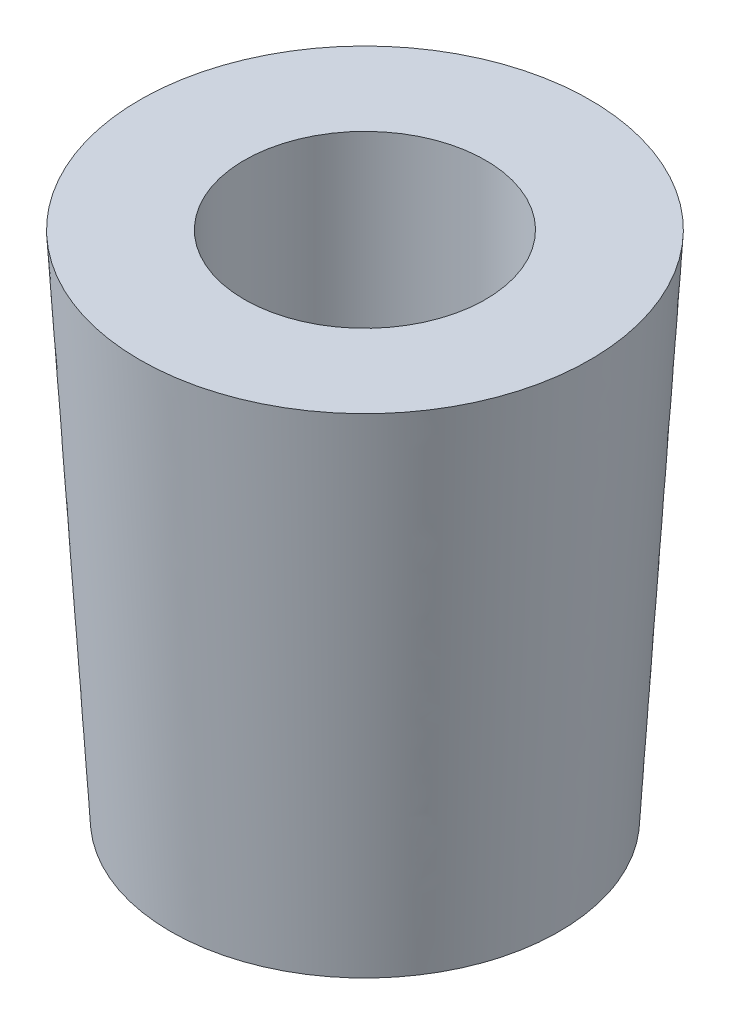
ISO-10303-21;
HEADER;
FILE_DESCRIPTION(('STEP AP214'),'2;1');
FILE_NAME('part.step','',(''),(''),'','','');
FILE_SCHEMA(('AUTOMOTIVE_DESIGN { 1 0 10303 214 1 1 1 1 }'));
ENDSEC;
DATA;
#1=APPLICATION_CONTEXT('core data for automotive mechanical design processes');
#2=APPLICATION_PROTOCOL_DEFINITION('international standard','automotive_design',2000,#1);
#3=PRODUCT_CONTEXT('',#1,'mechanical');
#4=PRODUCT('Part','Part','',(#3));
#5=PRODUCT_RELATED_PRODUCT_CATEGORY('part','',(#4));
#6=PRODUCT_DEFINITION_FORMATION('','',#4);
#7=PRODUCT_DEFINITION_CONTEXT('part definition',#1,'design');
#8=PRODUCT_DEFINITION('design','',#6,#7);
#9=PRODUCT_DEFINITION_SHAPE('','',#8);
#10=(LENGTH_UNIT() NAMED_UNIT(*) SI_UNIT(.MILLI.,.METRE.));
#11=(NAMED_UNIT(*) PLANE_ANGLE_UNIT() SI_UNIT($,.RADIAN.));
#12=(NAMED_UNIT(*) SI_UNIT($,.STERADIAN.) SOLID_ANGLE_UNIT());
#13=UNCERTAINTY_MEASURE_WITH_UNIT(LENGTH_MEASURE(1.E-05),#10,'distance_accuracy_value','');
#14=(GEOMETRIC_REPRESENTATION_CONTEXT(3) GLOBAL_UNCERTAINTY_ASSIGNED_CONTEXT((#13)) GLOBAL_UNIT_ASSIGNED_CONTEXT((#10,
#11,#12)) REPRESENTATION_CONTEXT('',''));
#15=CARTESIAN_POINT('',(0.,0.,0.));
#16=DIRECTION('',(0.,0.,1.));
#17=DIRECTION('',(1.,0.,0.));
#18=AXIS2_PLACEMENT_3D('',#15,#16,#17);
#19=CARTESIAN_POINT('',(0.,-3.175,0.));
#20=DIRECTION('',(0.,1.,0.));
#21=DIRECTION('',(0.,0.,1.));
#22=AXIS2_PLACEMENT_3D('',#19,#20,#21);
#23=PLANE('',#22);
#24=CARTESIAN_POINT('',(0.,-3.175,0.));
#25=DIRECTION('',(0.,1.,0.));
#26=DIRECTION('',(0.,0.,1.));
#27=AXIS2_PLACEMENT_3D('',#24,#25,#26);
#28=CIRCLE('',#27,1.5);
#29=CARTESIAN_POINT('',(0.,-3.175,1.5));
#30=VERTEX_POINT('',#29);
#31=EDGE_CURVE('E67',#30,#30,#28,.T.);
#32=ORIENTED_EDGE('',*,*,#31,.T.);
#33=EDGE_LOOP('',(#32));
#34=FACE_BOUND('',#33,.T.);
#35=CARTESIAN_POINT('',(0.,-3.175,0.));
#36=DIRECTION('',(0.,1.,0.));
#37=DIRECTION('',(0.,0.,1.));
#38=AXIS2_PLACEMENT_3D('',#35,#36,#37);
#39=CIRCLE('',#38,2.415);
#40=CARTESIAN_POINT('',(0.,-3.175,2.415));
#41=VERTEX_POINT('',#40);
#42=EDGE_CURVE('E12',#41,#41,#39,.T.);
#43=ORIENTED_EDGE('',*,*,#42,.F.);
#44=EDGE_LOOP('',(#43));
#45=FACE_BOUND('',#44,.T.);
#46=ADVANCED_FACE('F54',(#34,#45),#23,.F.);
#47=CARTESIAN_POINT('',(0.,3.175,0.));
#48=DIRECTION('',(0.,1.,0.));
#49=DIRECTION('',(0.,0.,1.));
#50=AXIS2_PLACEMENT_3D('',#47,#48,#49);
#51=PLANE('',#50);
#52=CARTESIAN_POINT('',(0.,3.175,0.));
#53=DIRECTION('',(0.,1.,0.));
#54=DIRECTION('',(0.,0.,1.));
#55=AXIS2_PLACEMENT_3D('',#52,#53,#54);
#56=CIRCLE('',#55,1.5);
#57=CARTESIAN_POINT('',(0.,3.175,1.5));
#58=VERTEX_POINT('',#57);
#59=EDGE_CURVE('E130',#58,#58,#56,.T.);
#60=ORIENTED_EDGE('',*,*,#59,.F.);
#61=EDGE_LOOP('',(#60));
#62=FACE_BOUND('',#61,.T.);
#63=CARTESIAN_POINT('',(0.,3.175,0.));
#64=DIRECTION('',(0.,1.,0.));
#65=DIRECTION('',(0.,0.,1.));
#66=AXIS2_PLACEMENT_3D('',#63,#64,#65);
#67=CIRCLE('',#66,2.8);
#68=CARTESIAN_POINT('',(0.,3.175,2.8));
#69=VERTEX_POINT('',#68);
#70=EDGE_CURVE('E62',#69,#69,#67,.T.);
#71=ORIENTED_EDGE('',*,*,#70,.T.);
#72=EDGE_LOOP('',(#71));
#73=FACE_BOUND('',#72,.T.);
#74=ADVANCED_FACE('F87',(#62,#73),#51,.T.);
#75=CARTESIAN_POINT('',(0.,3.175,2.8));
#76=CARTESIAN_POINT('',(0.,1.05833333333333,2.67166666666667));
#77=CARTESIAN_POINT('',(0.,-1.05833333333333,2.54333333333333));
#78=CARTESIAN_POINT('',(0.,-3.175,2.415));
#79=CARTESIAN_POINT('',(-0.0772681013892341,3.175,2.8));
#80=CARTESIAN_POINT('',(-0.0737266467422275,1.05833333333333,2.67166666666667));
#81=CARTESIAN_POINT('',(-0.070185192095221,-1.05833333333333,2.54333333333333));
#82=CARTESIAN_POINT('',(-0.0666437374482144,-3.175,2.415));
#83=CARTESIAN_POINT('',(-0.230350683889855,3.175,2.79372681013892));
#84=CARTESIAN_POINT('',(-0.21979294421157,1.05833333333333,2.66568099800756));
#85=CARTESIAN_POINT('',(-0.209235204533285,-1.05833333333333,2.53763518587619));
#86=CARTESIAN_POINT('',(-0.198677464855,-3.175,2.40958937374482));
#87=CARTESIAN_POINT('',(-0.454890761369762,3.175,2.76622039120156));
#88=CARTESIAN_POINT('',(-0.434041601473648,1.05833333333333,2.63943528993816));
#89=CARTESIAN_POINT('',(-0.413192441577534,-1.05833333333333,2.51265018867475));
#90=CARTESIAN_POINT('',(-0.39234328168142,-3.175,2.38586508741135));
#91=CARTESIAN_POINT('',(-0.67362410714116,3.175,2.72134027355594));
#92=CARTESIAN_POINT('',(-0.642749668897191,1.05833333333333,2.59661217768463));
#93=CARTESIAN_POINT('',(-0.611875230653221,-1.05833333333333,2.47188408181331));
#94=CARTESIAN_POINT('',(-0.581000792409251,-3.175,2.347155985942));
#95=CARTESIAN_POINT('',(-1.94684617889358,3.175,2.35215498805756));
#96=CARTESIAN_POINT('',(-1.85761572902763,1.05833333333333,2.24434788443825));
#97=CARTESIAN_POINT('',(-1.76838527916167,-1.05833333333333,2.13654078081895));
#98=CARTESIAN_POINT('',(-1.67915482929572,-3.175,2.02873367719964));
#99=CARTESIAN_POINT('',(-2.8,3.175,1.23628962222774));
#100=CARTESIAN_POINT('',(-2.67166666666667,1.05833333333333,1.17962634787564));
#101=CARTESIAN_POINT('',(-2.54333333333333,-1.05833333333333,1.12296307352353));
#102=CARTESIAN_POINT('',(-2.415,-3.175,1.06629979917143));
#103=CARTESIAN_POINT('',(-2.8,3.175,-1.54536202778468));
#104=CARTESIAN_POINT('',(-2.67166666666667,1.05833333333333,-1.47453293484455));
#105=CARTESIAN_POINT('',(-2.54333333333333,-1.05833333333333,-1.40370384190442));
#106=CARTESIAN_POINT('',(-2.415,-3.175,-1.33287474896429));
#107=CARTESIAN_POINT('',(-1.54536202778468,3.175,-2.8));
#108=CARTESIAN_POINT('',(-1.47453293484455,1.05833333333333,-2.67166666666667));
#109=CARTESIAN_POINT('',(-1.40370384190442,-1.05833333333333,-2.54333333333333));
#110=CARTESIAN_POINT('',(-1.33287474896429,-3.175,-2.415));
#111=CARTESIAN_POINT('',(1.54536202778468,3.175,-2.8));
#112=CARTESIAN_POINT('',(1.47453293484455,1.05833333333333,-2.67166666666667));
#113=CARTESIAN_POINT('',(1.40370384190442,-1.05833333333333,-2.54333333333333));
#114=CARTESIAN_POINT('',(1.33287474896429,-3.175,-2.415));
#115=CARTESIAN_POINT('',(2.8,3.175,-1.54536202778468));
#116=CARTESIAN_POINT('',(2.67166666666667,1.05833333333333,-1.47453293484455));
#117=CARTESIAN_POINT('',(2.54333333333333,-1.05833333333333,-1.40370384190442));
#118=CARTESIAN_POINT('',(2.415,-3.175,-1.33287474896429));
#119=CARTESIAN_POINT('',(2.8,3.175,1.23628962222774));
#120=CARTESIAN_POINT('',(2.67166666666667,1.05833333333333,1.17962634787564));
#121=CARTESIAN_POINT('',(2.54333333333333,-1.05833333333333,1.12296307352353));
#122=CARTESIAN_POINT('',(2.415,-3.175,1.06629979917143));
#123=CARTESIAN_POINT('',(1.94684617889358,3.175,2.35215498805756));
#124=CARTESIAN_POINT('',(1.85761572902763,1.05833333333333,2.24434788443825));
#125=CARTESIAN_POINT('',(1.76838527916167,-1.05833333333333,2.13654078081895));
#126=CARTESIAN_POINT('',(1.67915482929572,-3.175,2.02873367719964));
#127=CARTESIAN_POINT('',(0.67362410714116,3.175,2.72134027355594));
#128=CARTESIAN_POINT('',(0.64274966889719,1.05833333333333,2.59661217768463));
#129=CARTESIAN_POINT('',(0.61187523065322,-1.05833333333333,2.47188408181331));
#130=CARTESIAN_POINT('',(0.58100079240925,-3.175,2.347155985942));
#131=CARTESIAN_POINT('',(0.454890761369762,3.175,2.76622039120156));
#132=CARTESIAN_POINT('',(0.434041601473648,1.05833333333333,2.63943528993816));
#133=CARTESIAN_POINT('',(0.413192441577533,-1.05833333333333,2.51265018867475));
#134=CARTESIAN_POINT('',(0.392343281681419,-3.175,2.38586508741135));
#135=CARTESIAN_POINT('',(0.230350683889855,3.175,2.79372681013892));
#136=CARTESIAN_POINT('',(0.21979294421157,1.05833333333333,2.66568099800756));
#137=CARTESIAN_POINT('',(0.209235204533285,-1.05833333333333,2.53763518587619));
#138=CARTESIAN_POINT('',(0.198677464855,-3.175,2.40958937374482));
#139=CARTESIAN_POINT('',(0.0772681013892334,3.175,2.8));
#140=CARTESIAN_POINT('',(0.0737266467422269,1.05833333333333,2.67166666666667));
#141=CARTESIAN_POINT('',(0.0701851920952203,-1.05833333333333,2.54333333333333));
#142=CARTESIAN_POINT('',(0.0666437374482138,-3.175,2.415));
#143=CARTESIAN_POINT('',(0.,3.175,2.8));
#144=CARTESIAN_POINT('',(0.,1.05833333333333,2.67166666666667));
#145=CARTESIAN_POINT('',(0.,-1.05833333333333,2.54333333333333));
#146=CARTESIAN_POINT('',(0.,-3.175,2.415));
#147=B_SPLINE_SURFACE_WITH_KNOTS('',3,3,((#75,#76,#77,#78),(#79,#80,#81,#82),(#83,#84,#85,#86),
(#87,#88,#89,#90),(#91,#92,#93,#94),(#95,#96,#97,#98),(#99,#100,#101,#102),(#103,#104,#105,
#106),(#107,#108,#109,#110),(#111,#112,#113,#114),(#115,#116,#117,#118),(#119,#120,#121,#122),
(#123,#124,#125,#126),(#127,#128,#129,#130),(#131,#132,#133,#134),(#135,#136,#137,#138),(#139,
#140,#141,#142),(#143,#144,#145,#146)),.UNSPECIFIED.,.T.,.F.,.F.,(4,1,1,1,1,2,2,2,1,1,1,1,4),(4,
4),(0.,0.0125,0.0249999999999999,0.0375000000000001,0.05,0.25,0.5,0.75,0.95,0.9625,0.975,0.9875,
1.),(0.,1.),.UNSPECIFIED.);
#148=CARTESIAN_POINT('',(0.,3.175,2.8));
#149=CARTESIAN_POINT('',(0.,3.10885416666667,2.79598958333333));
#150=CARTESIAN_POINT('',(0.,3.04270833333333,2.79197916666667));
#151=CARTESIAN_POINT('',(0.,2.91041666666667,2.78395833333333));
#152=CARTESIAN_POINT('',(0.,2.84427083333333,2.77994791666667));
#153=CARTESIAN_POINT('',(0.,2.71197916666667,2.77192708333333));
#154=CARTESIAN_POINT('',(0.,2.64583333333333,2.76791666666667));
#155=CARTESIAN_POINT('',(0.,2.51354166666667,2.75989583333333));
#156=CARTESIAN_POINT('',(0.,2.44739583333333,2.75588541666667));
#157=CARTESIAN_POINT('',(0.,2.31510416666667,2.74786458333333));
#158=CARTESIAN_POINT('',(0.,2.24895833333333,2.74385416666667));
#159=CARTESIAN_POINT('',(0.,2.11666666666667,2.73583333333333));
#160=CARTESIAN_POINT('',(0.,2.05052083333333,2.73182291666667));
#161=CARTESIAN_POINT('',(0.,1.91822916666667,2.72380208333333));
#162=CARTESIAN_POINT('',(0.,1.85208333333333,2.71979166666667));
#163=CARTESIAN_POINT('',(0.,1.71979166666667,2.71177083333333));
#164=CARTESIAN_POINT('',(0.,1.65364583333333,2.70776041666667));
#165=CARTESIAN_POINT('',(0.,1.52135416666667,2.69973958333333));
#166=CARTESIAN_POINT('',(0.,1.45520833333333,2.69572916666667));
#167=CARTESIAN_POINT('',(0.,1.32291666666667,2.68770833333333));
#168=CARTESIAN_POINT('',(0.,1.25677083333333,2.68369791666667));
#169=CARTESIAN_POINT('',(0.,1.12447916666667,2.67567708333333));
#170=CARTESIAN_POINT('',(0.,1.05833333333333,2.67166666666667));
#171=CARTESIAN_POINT('',(0.,0.926041666666667,2.66364583333333));
#172=CARTESIAN_POINT('',(0.,0.859895833333333,2.65963541666667));
#173=CARTESIAN_POINT('',(0.,0.727604166666667,2.65161458333333));
#174=CARTESIAN_POINT('',(0.,0.661458333333333,2.64760416666667));
#175=CARTESIAN_POINT('',(0.,0.529166666666667,2.63958333333333));
#176=CARTESIAN_POINT('',(0.,0.463020833333333,2.63557291666667));
#177=CARTESIAN_POINT('',(0.,0.330729166666667,2.62755208333333));
#178=CARTESIAN_POINT('',(0.,0.264583333333333,2.62354166666667));
#179=CARTESIAN_POINT('',(0.,0.132291666666667,2.61552083333333));
#180=CARTESIAN_POINT('',(0.,0.0661458333333333,2.61151041666667));
#181=CARTESIAN_POINT('',(0.,-0.0661458333333333,2.60348958333333));
#182=CARTESIAN_POINT('',(0.,-0.132291666666667,2.59947916666667));
#183=CARTESIAN_POINT('',(0.,-0.264583333333333,2.59145833333333));
#184=CARTESIAN_POINT('',(0.,-0.330729166666667,2.58744791666667));
#185=CARTESIAN_POINT('',(0.,-0.463020833333333,2.57942708333333));
#186=CARTESIAN_POINT('',(0.,-0.529166666666667,2.57541666666667));
#187=CARTESIAN_POINT('',(0.,-0.661458333333333,2.56739583333333));
#188=CARTESIAN_POINT('',(0.,-0.727604166666667,2.56338541666667));
#189=CARTESIAN_POINT('',(0.,-0.859895833333333,2.55536458333333));
#190=CARTESIAN_POINT('',(0.,-0.926041666666667,2.55135416666667));
#191=CARTESIAN_POINT('',(0.,-1.05833333333333,2.54333333333333));
#192=CARTESIAN_POINT('',(0.,-1.12447916666667,2.53932291666667));
#193=CARTESIAN_POINT('',(0.,-1.25677083333333,2.53130208333333));
#194=CARTESIAN_POINT('',(0.,-1.32291666666667,2.52729166666667));
#195=CARTESIAN_POINT('',(0.,-1.45520833333333,2.51927083333333));
#196=CARTESIAN_POINT('',(0.,-1.52135416666667,2.51526041666667));
#197=CARTESIAN_POINT('',(0.,-1.65364583333333,2.50723958333333));
#198=CARTESIAN_POINT('',(0.,-1.71979166666667,2.50322916666667));
#199=CARTESIAN_POINT('',(0.,-1.85208333333333,2.49520833333333));
#200=CARTESIAN_POINT('',(0.,-1.91822916666667,2.49119791666667));
#201=CARTESIAN_POINT('',(0.,-2.05052083333333,2.48317708333333));
#202=CARTESIAN_POINT('',(0.,-2.11666666666667,2.47916666666667));
#203=CARTESIAN_POINT('',(0.,-2.24895833333333,2.47114583333333));
#204=CARTESIAN_POINT('',(0.,-2.31510416666667,2.46713541666667));
#205=CARTESIAN_POINT('',(0.,-2.44739583333333,2.45911458333333));
#206=CARTESIAN_POINT('',(0.,-2.51354166666667,2.45510416666667));
#207=CARTESIAN_POINT('',(0.,-2.64583333333333,2.44708333333333));
#208=CARTESIAN_POINT('',(0.,-2.71197916666667,2.44307291666667));
#209=CARTESIAN_POINT('',(0.,-2.84427083333333,2.43505208333333));
#210=CARTESIAN_POINT('',(0.,-2.91041666666667,2.43104166666667));
#211=CARTESIAN_POINT('',(0.,-3.04270833333333,2.42302083333333));
#212=CARTESIAN_POINT('',(0.,-3.10885416666667,2.41901041666667));
#213=CARTESIAN_POINT('',(0.,-3.175,2.415));
#214=B_SPLINE_CURVE_WITH_KNOTS('',3,(#148,#149,#150,#151,#152,#153,#154,#155,#156,#157,#158,
#159,#160,#161,#162,#163,#164,#165,#166,#167,#168,#169,#170,#171,#172,#173,#174,#175,#176,#177,
#178,#179,#180,#181,#182,#183,#184,#185,#186,#187,#188,#189,#190,#191,#192,#193,#194,#195,#196,
#197,#198,#199,#200,#201,#202,#203,#204,#205,#206,#207,#208,#209,#210,#211,#212,#213),
.UNSPECIFIED.,.F.,.F.,(4,2,2,2,2,2,2,2,2,2,2,2,2,2,2,2,2,2,2,2,2,2,2,2,2,2,2,2,2,2,2,2,4),(0.,
0.19880189230189,0.39760378460378,0.596405676905672,0.795207569207562,0.994009461509453,
1.19281135381134,1.39161324611323,1.59041513841512,1.78921703071702,1.98801892301891,
2.1868208153208,2.38562270762269,2.58442459992458,2.78322649222647,2.98202838452836,
3.18083027683025,3.37963216913214,3.57843406143403,3.77723595373592,3.97603784603781,
4.1748397383397,4.37364163064159,4.57244352294348,4.77124541524537,4.97004730754727,
5.16884919984916,5.36765109215105,5.56645298445294,5.76525487675483,5.96405676905672,
6.16285866135861,6.3616605536605),.UNSPECIFIED.);
#215=EDGE_CURVE('BSEAM96',#69,#41,#214,.T.);
#216=ORIENTED_EDGE('',*,*,#70,.F.);
#217=ORIENTED_EDGE('',*,*,#42,.T.);
#218=ORIENTED_EDGE('',*,*,#215,.T.);
#219=ORIENTED_EDGE('',*,*,#215,.F.);
#220=EDGE_LOOP('',(#216,#218,#217,#219));
#221=FACE_BOUND('',#220,.T.);
#222=ADVANCED_FACE('F96',(#221),#147,.T.);
#223=CARTESIAN_POINT('',(0.,-3.18186210335465,0.));
#224=DIRECTION('',(0.,1.,0.));
#225=DIRECTION('',(0.,0.,1.));
#226=AXIS2_PLACEMENT_3D('',#223,#224,#225);
#227=CYLINDRICAL_SURFACE('',#226,1.5);
#228=CARTESIAN_POINT('',(0.,3.175,1.5));
#229=CARTESIAN_POINT('',(0.,3.10885416666667,1.5));
#230=CARTESIAN_POINT('',(0.,3.04270833333333,1.5));
#231=CARTESIAN_POINT('',(0.,2.91041666666667,1.5));
#232=CARTESIAN_POINT('',(0.,2.84427083333333,1.5));
#233=CARTESIAN_POINT('',(0.,2.71197916666667,1.5));
#234=CARTESIAN_POINT('',(0.,2.64583333333333,1.5));
#235=CARTESIAN_POINT('',(0.,2.51354166666667,1.5));
#236=CARTESIAN_POINT('',(0.,2.44739583333333,1.5));
#237=CARTESIAN_POINT('',(0.,2.31510416666667,1.5));
#238=CARTESIAN_POINT('',(0.,2.24895833333333,1.5));
#239=CARTESIAN_POINT('',(0.,2.11666666666667,1.5));
#240=CARTESIAN_POINT('',(0.,2.05052083333333,1.5));
#241=CARTESIAN_POINT('',(0.,1.91822916666667,1.5));
#242=CARTESIAN_POINT('',(0.,1.85208333333333,1.5));
#243=CARTESIAN_POINT('',(0.,1.71979166666667,1.5));
#244=CARTESIAN_POINT('',(0.,1.65364583333333,1.5));
#245=CARTESIAN_POINT('',(0.,1.52135416666667,1.5));
#246=CARTESIAN_POINT('',(0.,1.45520833333333,1.5));
#247=CARTESIAN_POINT('',(0.,1.32291666666667,1.5));
#248=CARTESIAN_POINT('',(0.,1.25677083333333,1.5));
#249=CARTESIAN_POINT('',(0.,1.12447916666667,1.5));
#250=CARTESIAN_POINT('',(0.,1.05833333333333,1.5));
#251=CARTESIAN_POINT('',(0.,0.926041666666666,1.5));
#252=CARTESIAN_POINT('',(0.,0.859895833333333,1.5));
#253=CARTESIAN_POINT('',(0.,0.727604166666666,1.5));
#254=CARTESIAN_POINT('',(0.,0.661458333333333,1.5));
#255=CARTESIAN_POINT('',(0.,0.529166666666666,1.5));
#256=CARTESIAN_POINT('',(0.,0.463020833333333,1.5));
#257=CARTESIAN_POINT('',(0.,0.330729166666666,1.5));
#258=CARTESIAN_POINT('',(0.,0.264583333333333,1.5));
#259=CARTESIAN_POINT('',(0.,0.132291666666666,1.5));
#260=CARTESIAN_POINT('',(0.,0.0661458333333328,1.5));
#261=CARTESIAN_POINT('',(0.,-0.0661458333333337,1.5));
#262=CARTESIAN_POINT('',(0.,-0.132291666666667,1.5));
#263=CARTESIAN_POINT('',(0.,-0.264583333333334,1.5));
#264=CARTESIAN_POINT('',(0.,-0.330729166666667,1.5));
#265=CARTESIAN_POINT('',(0.,-0.463020833333334,1.5));
#266=CARTESIAN_POINT('',(0.,-0.529166666666667,1.5));
#267=CARTESIAN_POINT('',(0.,-0.661458333333334,1.5));
#268=CARTESIAN_POINT('',(0.,-0.727604166666667,1.5));
#269=CARTESIAN_POINT('',(0.,-0.859895833333334,1.5));
#270=CARTESIAN_POINT('',(0.,-0.926041666666667,1.5));
#271=CARTESIAN_POINT('',(0.,-1.05833333333333,1.5));
#272=CARTESIAN_POINT('',(0.,-1.12447916666667,1.5));
#273=CARTESIAN_POINT('',(0.,-1.25677083333333,1.5));
#274=CARTESIAN_POINT('',(0.,-1.32291666666667,1.5));
#275=CARTESIAN_POINT('',(0.,-1.45520833333333,1.5));
#276=CARTESIAN_POINT('',(0.,-1.52135416666667,1.5));
#277=CARTESIAN_POINT('',(0.,-1.65364583333333,1.5));
#278=CARTESIAN_POINT('',(0.,-1.71979166666667,1.5));
#279=CARTESIAN_POINT('',(0.,-1.85208333333333,1.5));
#280=CARTESIAN_POINT('',(0.,-1.91822916666667,1.5));
#281=CARTESIAN_POINT('',(0.,-2.05052083333333,1.5));
#282=CARTESIAN_POINT('',(0.,-2.11666666666667,1.5));
#283=CARTESIAN_POINT('',(0.,-2.24895833333333,1.5));
#284=CARTESIAN_POINT('',(0.,-2.31510416666667,1.5));
#285=CARTESIAN_POINT('',(0.,-2.44739583333333,1.5));
#286=CARTESIAN_POINT('',(0.,-2.51354166666667,1.5));
#287=CARTESIAN_POINT('',(0.,-2.64583333333333,1.5));
#288=CARTESIAN_POINT('',(0.,-2.71197916666667,1.5));
#289=CARTESIAN_POINT('',(0.,-2.84427083333333,1.5));
#290=CARTESIAN_POINT('',(0.,-2.91041666666667,1.5));
#291=CARTESIAN_POINT('',(0.,-3.04270833333333,1.5));
#292=CARTESIAN_POINT('',(0.,-3.10885416666667,1.5));
#293=CARTESIAN_POINT('',(0.,-3.175,1.5));
#294=B_SPLINE_CURVE_WITH_KNOTS('',3,(#228,#229,#230,#231,#232,#233,#234,#235,#236,#237,#238,
#239,#240,#241,#242,#243,#244,#245,#246,#247,#248,#249,#250,#251,#252,#253,#254,#255,#256,#257,
#258,#259,#260,#261,#262,#263,#264,#265,#266,#267,#268,#269,#270,#271,#272,#273,#274,#275,#276,
#277,#278,#279,#280,#281,#282,#283,#284,#285,#286,#287,#288,#289,#290,#291,#292,#293),
.UNSPECIFIED.,.F.,.F.,(4,2,2,2,2,2,2,2,2,2,2,2,2,2,2,2,2,2,2,2,2,2,2,2,2,2,2,2,2,2,2,2,4),(0.,
0.1984375,0.396875,0.5953125,0.79375,0.9921875,1.190625,1.3890625,1.5875,1.7859375,1.984375,
2.1828125,2.38125,2.5796875,2.778125,2.9765625,3.175,3.3734375,3.571875,3.7703125,3.96875,
4.1671875,4.365625,4.5640625,4.7625,4.9609375,5.159375,5.3578125,5.55625,5.7546875,5.953125,
6.1515625,6.35),.UNSPECIFIED.);
#295=EDGE_CURVE('BSEAM98',#58,#30,#294,.T.);
#296=ORIENTED_EDGE('',*,*,#59,.T.);
#297=ORIENTED_EDGE('',*,*,#31,.F.);
#298=ORIENTED_EDGE('',*,*,#295,.T.);
#299=ORIENTED_EDGE('',*,*,#295,.F.);
#300=EDGE_LOOP('',(#296,#298,#297,#299));
#301=FACE_BOUND('',#300,.T.);
#302=ADVANCED_FACE('F98',(#301),#227,.F.);
#303=CLOSED_SHELL('',(#46,#74,#222,#302));
#304=MANIFOLD_SOLID_BREP('B2',#303);
#305=ADVANCED_BREP_SHAPE_REPRESENTATION('',(#18,#304),#14);
#306=SHAPE_DEFINITION_REPRESENTATION(#9,#305);
ENDSEC;
END-ISO-10303-21;
